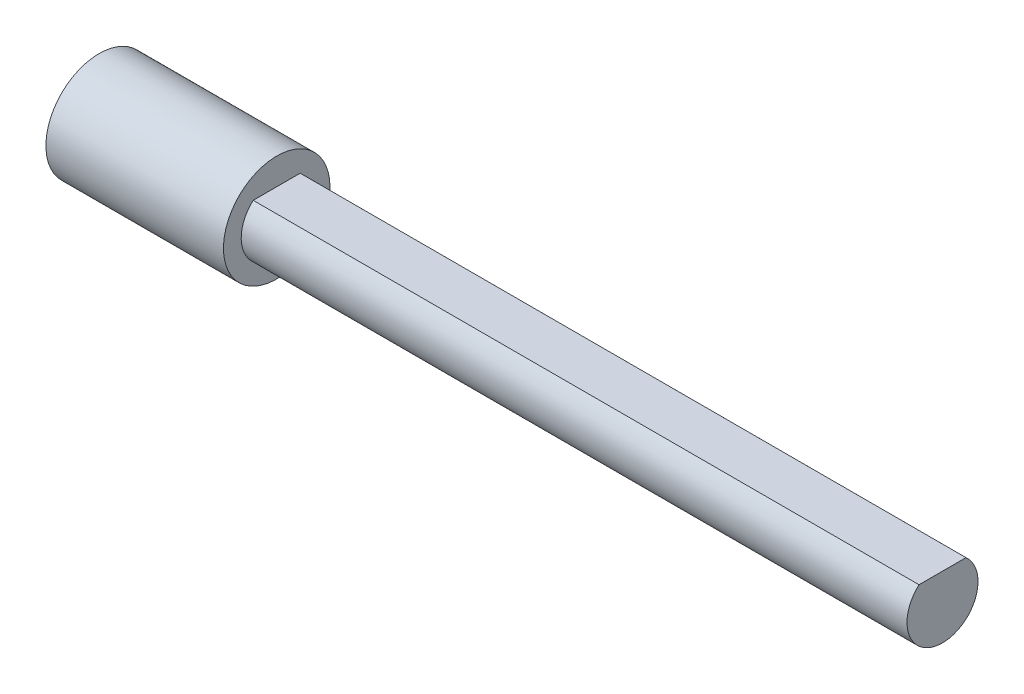
ISO-10303-21;
HEADER;
FILE_DESCRIPTION(('STEP AP214'),'2;1');
FILE_NAME('part.step','',(''),(''),'','','');
FILE_SCHEMA(('AUTOMOTIVE_DESIGN { 1 0 10303 214 1 1 1 1 }'));
ENDSEC;
DATA;
#1=APPLICATION_CONTEXT('core data for automotive mechanical design processes');
#2=APPLICATION_PROTOCOL_DEFINITION('international standard','automotive_design',2000,#1);
#3=PRODUCT_CONTEXT('',#1,'mechanical');
#4=PRODUCT('Part','Part','',(#3));
#5=PRODUCT_RELATED_PRODUCT_CATEGORY('part','',(#4));
#6=PRODUCT_DEFINITION_FORMATION('','',#4);
#7=PRODUCT_DEFINITION_CONTEXT('part definition',#1,'design');
#8=PRODUCT_DEFINITION('design','',#6,#7);
#9=PRODUCT_DEFINITION_SHAPE('','',#8);
#10=(LENGTH_UNIT() NAMED_UNIT(*) SI_UNIT(.MILLI.,.METRE.));
#11=(NAMED_UNIT(*) PLANE_ANGLE_UNIT() SI_UNIT($,.RADIAN.));
#12=(NAMED_UNIT(*) SI_UNIT($,.STERADIAN.) SOLID_ANGLE_UNIT());
#13=UNCERTAINTY_MEASURE_WITH_UNIT(LENGTH_MEASURE(1.E-05),#10,'distance_accuracy_value','');
#14=(GEOMETRIC_REPRESENTATION_CONTEXT(3) GLOBAL_UNCERTAINTY_ASSIGNED_CONTEXT((#13)) GLOBAL_UNIT_ASSIGNED_CONTEXT((#10,
#11,#12)) REPRESENTATION_CONTEXT('',''));
#15=CARTESIAN_POINT('',(0.,0.,0.));
#16=DIRECTION('',(0.,0.,1.));
#17=DIRECTION('',(1.,0.,0.));
#18=AXIS2_PLACEMENT_3D('',#15,#16,#17);
#19=CARTESIAN_POINT('',(20.,0.,0.));
#20=DIRECTION('',(-1.,0.,0.));
#21=DIRECTION('',(0.,0.,1.));
#22=AXIS2_PLACEMENT_3D('',#19,#20,#21);
#23=CYLINDRICAL_SURFACE('',#22,6.);
#24=CARTESIAN_POINT('',(20.,0.,0.));
#25=DIRECTION('',(1.,0.,0.));
#26=DIRECTION('',(0.,0.,-1.));
#27=AXIS2_PLACEMENT_3D('',#24,#25,#26);
#28=CIRCLE('',#27,6.);
#29=CARTESIAN_POINT('',(20.,0.,-6.));
#30=VERTEX_POINT('',#29);
#31=EDGE_CURVE('E11',#30,#30,#28,.T.);
#32=ORIENTED_EDGE('',*,*,#31,.F.);
#33=EDGE_LOOP('',(#32));
#34=FACE_BOUND('',#33,.T.);
#35=CARTESIAN_POINT('',(0.,0.,0.));
#36=DIRECTION('',(1.,0.,0.));
#37=DIRECTION('',(0.,0.,-1.));
#38=AXIS2_PLACEMENT_3D('',#35,#36,#37);
#39=CIRCLE('',#38,6.);
#40=CARTESIAN_POINT('',(0.,0.,-6.));
#41=VERTEX_POINT('',#40);
#42=EDGE_CURVE('E42',#41,#41,#39,.T.);
#43=ORIENTED_EDGE('',*,*,#42,.T.);
#44=EDGE_LOOP('',(#43));
#45=FACE_BOUND('',#44,.T.);
#46=ADVANCED_FACE('F39',(#34,#45),#23,.T.);
#47=CARTESIAN_POINT('',(20.,0.,0.));
#48=DIRECTION('',(1.,0.,0.));
#49=DIRECTION('',(0.,0.,-1.));
#50=AXIS2_PLACEMENT_3D('',#47,#48,#49);
#51=PLANE('',#50);
#52=CARTESIAN_POINT('',(20.,0.,0.));
#53=DIRECTION('',(1.,0.,0.));
#54=DIRECTION('',(0.,0.,-1.));
#55=AXIS2_PLACEMENT_3D('',#52,#53,#54);
#56=CIRCLE('',#55,4.);
#57=CARTESIAN_POINT('',(20.,3.,2.64575131106459));
#58=VERTEX_POINT('',#57);
#59=CARTESIAN_POINT('',(20.,3.,-2.64575131106459));
#60=VERTEX_POINT('',#59);
#61=EDGE_CURVE('E109',#58,#60,#56,.T.);
#62=ORIENTED_EDGE('',*,*,#61,.F.);
#63=DIRECTION('',(0.,0.,1.));
#64=VECTOR('',#63,1.);
#65=CARTESIAN_POINT('',(20.,3.,-2.64575131106459));
#66=LINE('',#65,#64);
#67=EDGE_CURVE('E53',#60,#58,#66,.T.);
#68=ORIENTED_EDGE('',*,*,#67,.F.);
#69=EDGE_LOOP('',(#62,#68));
#70=FACE_BOUND('',#69,.T.);
#71=ORIENTED_EDGE('',*,*,#31,.T.);
#72=EDGE_LOOP('',(#71));
#73=FACE_BOUND('',#72,.T.);
#74=ADVANCED_FACE('F186',(#70,#73),#51,.T.);
#75=CARTESIAN_POINT('',(0.,0.,0.));
#76=DIRECTION('',(1.,0.,0.));
#77=DIRECTION('',(0.,0.,-1.));
#78=AXIS2_PLACEMENT_3D('',#75,#76,#77);
#79=PLANE('',#78);
#80=DIRECTION('',(0.,0.,1.));
#81=VECTOR('',#80,1.);
#82=CARTESIAN_POINT('',(0.,-3.1,-2.68328157299975));
#83=LINE('',#82,#81);
#84=CARTESIAN_POINT('',(0.,-3.1,-2.68328157299975));
#85=VERTEX_POINT('',#84);
#86=CARTESIAN_POINT('',(0.,-3.1,2.68328157299975));
#87=VERTEX_POINT('',#86);
#88=EDGE_CURVE('E114',#85,#87,#83,.T.);
#89=ORIENTED_EDGE('',*,*,#88,.F.);
#90=CARTESIAN_POINT('',(0.,0.,0.));
#91=DIRECTION('',(-1.,0.,0.));
#92=DIRECTION('',(0.,0.,1.));
#93=AXIS2_PLACEMENT_3D('',#90,#91,#92);
#94=CIRCLE('',#93,4.1);
#95=CARTESIAN_POINT('',(0.,3.1,-2.68328157299975));
#96=VERTEX_POINT('',#95);
#97=EDGE_CURVE('E61',#96,#85,#94,.T.);
#98=ORIENTED_EDGE('',*,*,#97,.F.);
#99=DIRECTION('',(0.,0.,-1.));
#100=VECTOR('',#99,1.);
#101=CARTESIAN_POINT('',(0.,3.1,-2.68328157299975));
#102=LINE('',#101,#100);
#103=CARTESIAN_POINT('',(0.,3.1,2.68328157299975));
#104=VERTEX_POINT('',#103);
#105=EDGE_CURVE('E124',#104,#96,#102,.T.);
#106=ORIENTED_EDGE('',*,*,#105,.F.);
#107=CARTESIAN_POINT('',(0.,0.,0.));
#108=DIRECTION('',(-1.,0.,0.));
#109=DIRECTION('',(0.,0.,1.));
#110=AXIS2_PLACEMENT_3D('',#107,#108,#109);
#111=CIRCLE('',#110,4.1);
#112=EDGE_CURVE('E140',#87,#104,#111,.T.);
#113=ORIENTED_EDGE('',*,*,#112,.F.);
#114=EDGE_LOOP('',(#89,#98,#106,#113));
#115=FACE_BOUND('',#114,.T.);
#116=ORIENTED_EDGE('',*,*,#42,.F.);
#117=EDGE_LOOP('',(#116));
#118=FACE_BOUND('',#117,.T.);
#119=ADVANCED_FACE('F164',(#115,#118),#79,.F.);
#120=CARTESIAN_POINT('',(15.,0.,0.));
#121=DIRECTION('',(-1.,0.,0.));
#122=DIRECTION('',(0.,0.,1.));
#123=AXIS2_PLACEMENT_3D('',#120,#121,#122);
#124=CYLINDRICAL_SURFACE('',#123,4.1);
#125=ORIENTED_EDGE('',*,*,#97,.T.);
#126=DIRECTION('',(-1.,0.,0.));
#127=VECTOR('',#126,1.);
#128=CARTESIAN_POINT('',(15.,-3.1,-2.68328157299975));
#129=LINE('',#128,#127);
#130=CARTESIAN_POINT('',(15.,-3.1,-2.68328157299975));
#131=VERTEX_POINT('',#130);
#132=EDGE_CURVE('E135',#131,#85,#129,.T.);
#133=ORIENTED_EDGE('',*,*,#132,.F.);
#134=CARTESIAN_POINT('',(15.,0.,0.));
#135=DIRECTION('',(-1.,0.,0.));
#136=DIRECTION('',(0.,0.,1.));
#137=AXIS2_PLACEMENT_3D('',#134,#135,#136);
#138=CIRCLE('',#137,4.1);
#139=CARTESIAN_POINT('',(15.,3.1,-2.68328157299975));
#140=VERTEX_POINT('',#139);
#141=EDGE_CURVE('E119',#140,#131,#138,.T.);
#142=ORIENTED_EDGE('',*,*,#141,.F.);
#143=DIRECTION('',(-1.,0.,0.));
#144=VECTOR('',#143,1.);
#145=CARTESIAN_POINT('',(15.,3.1,-2.68328157299975));
#146=LINE('',#145,#144);
#147=EDGE_CURVE('E147',#140,#96,#146,.T.);
#148=ORIENTED_EDGE('',*,*,#147,.T.);
#149=EDGE_LOOP('',(#125,#133,#142,#148));
#150=FACE_BOUND('',#149,.T.);
#151=ADVANCED_FACE('F173',(#150),#124,.F.);
#152=CARTESIAN_POINT('',(15.,3.1,-2.68328157299975));
#153=DIRECTION('',(0.,1.,0.));
#154=DIRECTION('',(0.,0.,1.));
#155=AXIS2_PLACEMENT_3D('',#152,#153,#154);
#156=PLANE('',#155);
#157=ORIENTED_EDGE('',*,*,#105,.T.);
#158=ORIENTED_EDGE('',*,*,#147,.F.);
#159=DIRECTION('',(0.,0.,-1.));
#160=VECTOR('',#159,1.);
#161=CARTESIAN_POINT('',(15.,3.1,-2.68328157299975));
#162=LINE('',#161,#160);
#163=CARTESIAN_POINT('',(15.,3.1,2.68328157299975));
#164=VERTEX_POINT('',#163);
#165=EDGE_CURVE('E132',#164,#140,#162,.T.);
#166=ORIENTED_EDGE('',*,*,#165,.F.);
#167=DIRECTION('',(-1.,0.,0.));
#168=VECTOR('',#167,1.);
#169=CARTESIAN_POINT('',(15.,3.1,2.68328157299975));
#170=LINE('',#169,#168);
#171=EDGE_CURVE('E150',#164,#104,#170,.T.);
#172=ORIENTED_EDGE('',*,*,#171,.T.);
#173=EDGE_LOOP('',(#157,#158,#166,#172));
#174=FACE_BOUND('',#173,.T.);
#175=ADVANCED_FACE('F175',(#174),#156,.F.);
#176=CARTESIAN_POINT('',(15.,0.,0.));
#177=DIRECTION('',(-1.,0.,0.));
#178=DIRECTION('',(0.,0.,1.));
#179=AXIS2_PLACEMENT_3D('',#176,#177,#178);
#180=CYLINDRICAL_SURFACE('',#179,4.1);
#181=ORIENTED_EDGE('',*,*,#112,.T.);
#182=ORIENTED_EDGE('',*,*,#171,.F.);
#183=CARTESIAN_POINT('',(15.,0.,0.));
#184=DIRECTION('',(-1.,0.,0.));
#185=DIRECTION('',(0.,0.,1.));
#186=AXIS2_PLACEMENT_3D('',#183,#184,#185);
#187=CIRCLE('',#186,4.1);
#188=CARTESIAN_POINT('',(15.,-3.1,2.68328157299975));
#189=VERTEX_POINT('',#188);
#190=EDGE_CURVE('E128',#189,#164,#187,.T.);
#191=ORIENTED_EDGE('',*,*,#190,.F.);
#192=DIRECTION('',(-1.,0.,0.));
#193=VECTOR('',#192,1.);
#194=CARTESIAN_POINT('',(15.,-3.1,2.68328157299975));
#195=LINE('',#194,#193);
#196=EDGE_CURVE('E153',#189,#87,#195,.T.);
#197=ORIENTED_EDGE('',*,*,#196,.T.);
#198=EDGE_LOOP('',(#181,#182,#191,#197));
#199=FACE_BOUND('',#198,.T.);
#200=ADVANCED_FACE('F168',(#199),#180,.F.);
#201=CARTESIAN_POINT('',(15.,-3.1,-2.68328157299975));
#202=DIRECTION('',(0.,-1.,0.));
#203=DIRECTION('',(0.,0.,-1.));
#204=AXIS2_PLACEMENT_3D('',#201,#202,#203);
#205=PLANE('',#204);
#206=ORIENTED_EDGE('',*,*,#88,.T.);
#207=ORIENTED_EDGE('',*,*,#196,.F.);
#208=DIRECTION('',(0.,0.,1.));
#209=VECTOR('',#208,1.);
#210=CARTESIAN_POINT('',(15.,-3.1,-2.68328157299975));
#211=LINE('',#210,#209);
#212=EDGE_CURVE('E123',#131,#189,#211,.T.);
#213=ORIENTED_EDGE('',*,*,#212,.F.);
#214=ORIENTED_EDGE('',*,*,#132,.T.);
#215=EDGE_LOOP('',(#206,#207,#213,#214));
#216=FACE_BOUND('',#215,.T.);
#217=ADVANCED_FACE('F160',(#216),#205,.F.);
#218=CARTESIAN_POINT('',(15.,0.,0.));
#219=DIRECTION('',(-1.,0.,0.));
#220=DIRECTION('',(0.,0.,1.));
#221=AXIS2_PLACEMENT_3D('',#218,#219,#220);
#222=PLANE('',#221);
#223=ORIENTED_EDGE('',*,*,#141,.T.);
#224=ORIENTED_EDGE('',*,*,#212,.T.);
#225=ORIENTED_EDGE('',*,*,#190,.T.);
#226=ORIENTED_EDGE('',*,*,#165,.T.);
#227=EDGE_LOOP('',(#223,#224,#225,#226));
#228=FACE_BOUND('',#227,.T.);
#229=ADVANCED_FACE('F172',(#228),#222,.T.);
#230=CARTESIAN_POINT('',(95.,0.,0.));
#231=DIRECTION('',(-1.,0.,0.));
#232=DIRECTION('',(0.,0.,1.));
#233=AXIS2_PLACEMENT_3D('',#230,#231,#232);
#234=CYLINDRICAL_SURFACE('',#233,4.);
#235=ORIENTED_EDGE('',*,*,#61,.T.);
#236=DIRECTION('',(-1.,0.,0.));
#237=VECTOR('',#236,1.);
#238=CARTESIAN_POINT('',(95.,3.,-2.64575131106459));
#239=LINE('',#238,#237);
#240=CARTESIAN_POINT('',(95.,3.,-2.64575131106459));
#241=VERTEX_POINT('',#240);
#242=EDGE_CURVE('E95',#241,#60,#239,.T.);
#243=ORIENTED_EDGE('',*,*,#242,.F.);
#244=CARTESIAN_POINT('',(95.,0.,0.));
#245=DIRECTION('',(1.,0.,0.));
#246=DIRECTION('',(0.,0.,-1.));
#247=AXIS2_PLACEMENT_3D('',#244,#245,#246);
#248=CIRCLE('',#247,4.);
#249=CARTESIAN_POINT('',(95.,3.,2.64575131106459));
#250=VERTEX_POINT('',#249);
#251=EDGE_CURVE('E102',#250,#241,#248,.T.);
#252=ORIENTED_EDGE('',*,*,#251,.F.);
#253=DIRECTION('',(-1.,0.,0.));
#254=VECTOR('',#253,1.);
#255=CARTESIAN_POINT('',(95.,3.,2.64575131106459));
#256=LINE('',#255,#254);
#257=EDGE_CURVE('E98',#250,#58,#256,.T.);
#258=ORIENTED_EDGE('',*,*,#257,.T.);
#259=EDGE_LOOP('',(#235,#243,#252,#258));
#260=FACE_BOUND('',#259,.T.);
#261=ADVANCED_FACE('F108',(#260),#234,.T.);
#262=CARTESIAN_POINT('',(95.,3.,-2.64575131106459));
#263=DIRECTION('',(0.,-1.,0.));
#264=DIRECTION('',(0.,0.,-1.));
#265=AXIS2_PLACEMENT_3D('',#262,#263,#264);
#266=PLANE('',#265);
#267=ORIENTED_EDGE('',*,*,#67,.T.);
#268=ORIENTED_EDGE('',*,*,#257,.F.);
#269=DIRECTION('',(0.,0.,1.));
#270=VECTOR('',#269,1.);
#271=CARTESIAN_POINT('',(95.,3.,-2.64575131106459));
#272=LINE('',#271,#270);
#273=EDGE_CURVE('E91',#241,#250,#272,.T.);
#274=ORIENTED_EDGE('',*,*,#273,.F.);
#275=ORIENTED_EDGE('',*,*,#242,.T.);
#276=EDGE_LOOP('',(#267,#268,#274,#275));
#277=FACE_BOUND('',#276,.T.);
#278=ADVANCED_FACE('F93',(#277),#266,.F.);
#279=CARTESIAN_POINT('',(95.,0.,0.));
#280=DIRECTION('',(1.,0.,0.));
#281=DIRECTION('',(0.,0.,-1.));
#282=AXIS2_PLACEMENT_3D('',#279,#280,#281);
#283=PLANE('',#282);
#284=ORIENTED_EDGE('',*,*,#251,.T.);
#285=ORIENTED_EDGE('',*,*,#273,.T.);
#286=EDGE_LOOP('',(#284,#285));
#287=FACE_BOUND('',#286,.T.);
#288=ADVANCED_FACE('F104',(#287),#283,.T.);
#289=CLOSED_SHELL('',(#46,#74,#119,#151,#175,#200,#217,#229,#261,#278,#288));
#290=MANIFOLD_SOLID_BREP('B2',#289);
#291=ADVANCED_BREP_SHAPE_REPRESENTATION('',(#18,#290),#14);
#292=SHAPE_DEFINITION_REPRESENTATION(#9,#291);
ENDSEC;
END-ISO-10303-21;
